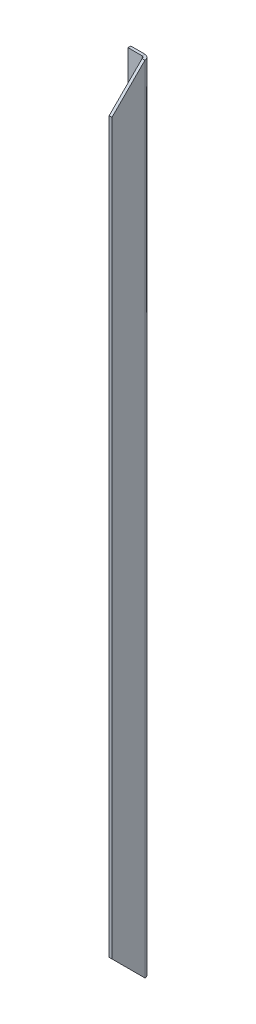
ISO-10303-21;
HEADER;
FILE_DESCRIPTION(('STEP AP214'),'2;1');
FILE_NAME('part.step','',(''),(''),'','','');
FILE_SCHEMA(('AUTOMOTIVE_DESIGN { 1 0 10303 214 1 1 1 1 }'));
ENDSEC;
DATA;
#1=APPLICATION_CONTEXT('core data for automotive mechanical design processes');
#2=APPLICATION_PROTOCOL_DEFINITION('international standard','automotive_design',2000,#1);
#3=PRODUCT_CONTEXT('',#1,'mechanical');
#4=PRODUCT('Part','Part','',(#3));
#5=PRODUCT_RELATED_PRODUCT_CATEGORY('part','',(#4));
#6=PRODUCT_DEFINITION_FORMATION('','',#4);
#7=PRODUCT_DEFINITION_CONTEXT('part definition',#1,'design');
#8=PRODUCT_DEFINITION('design','',#6,#7);
#9=PRODUCT_DEFINITION_SHAPE('','',#8);
#10=(LENGTH_UNIT() NAMED_UNIT(*) SI_UNIT(.MILLI.,.METRE.));
#11=(NAMED_UNIT(*) PLANE_ANGLE_UNIT() SI_UNIT($,.RADIAN.));
#12=(NAMED_UNIT(*) SI_UNIT($,.STERADIAN.) SOLID_ANGLE_UNIT());
#13=UNCERTAINTY_MEASURE_WITH_UNIT(LENGTH_MEASURE(1.E-05),#10,'distance_accuracy_value','');
#14=(GEOMETRIC_REPRESENTATION_CONTEXT(3) GLOBAL_UNCERTAINTY_ASSIGNED_CONTEXT((#13)) GLOBAL_UNIT_ASSIGNED_CONTEXT((#10,
#11,#12)) REPRESENTATION_CONTEXT('',''));
#15=CARTESIAN_POINT('',(0.,0.,0.));
#16=DIRECTION('',(0.,0.,1.));
#17=DIRECTION('',(1.,0.,0.));
#18=AXIS2_PLACEMENT_3D('',#15,#16,#17);
#19=CARTESIAN_POINT('',(1160.,-1198.5,-14.6953285374467));
#20=DIRECTION('',(1.,0.,0.));
#21=DIRECTION('',(0.,-1.,0.));
#22=AXIS2_PLACEMENT_3D('',#19,#20,#21);
#23=PLANE('',#22);
#24=DIRECTION('',(0.,1.,0.));
#25=VECTOR('',#24,1.);
#26=CARTESIAN_POINT('',(1160.,4.0129385336728E-12,-860.));
#27=LINE('',#26,#25);
#28=CARTESIAN_POINT('',(1160.,-1196.29289321881,-860.000000000001));
#29=VERTEX_POINT('',#28);
#30=CARTESIAN_POINT('',(1160.,-773.707106781191,-860.));
#31=VERTEX_POINT('',#30);
#32=EDGE_CURVE('E172',#29,#31,#27,.T.);
#33=ORIENTED_EDGE('',*,*,#32,.F.);
#34=DIRECTION('',(0.,0.,-1.));
#35=VECTOR('',#34,1.);
#36=CARTESIAN_POINT('',(1160.,-1196.29289321881,-14.6953285374467));
#37=LINE('',#36,#35);
#38=CARTESIAN_POINT('',(1160.,-1196.29289321881,-858.5));
#39=VERTEX_POINT('',#38);
#40=EDGE_CURVE('E174',#39,#29,#37,.T.);
#41=ORIENTED_EDGE('',*,*,#40,.F.);
#42=DIRECTION('',(0.,1.,0.));
#43=VECTOR('',#42,1.);
#44=CARTESIAN_POINT('',(1160.,-1198.5,-858.5));
#45=LINE('',#44,#43);
#46=CARTESIAN_POINT('',(1160.,-773.707106781191,-858.5));
#47=VERTEX_POINT('',#46);
#48=EDGE_CURVE('E73',#47,#39,#45,.F.);
#49=ORIENTED_EDGE('',*,*,#48,.F.);
#50=DIRECTION('',(0.,0.,-1.));
#51=VECTOR('',#50,1.);
#52=CARTESIAN_POINT('',(1160.,-773.707106781191,-14.6953285374462));
#53=LINE('',#52,#51);
#54=EDGE_CURVE('E186',#47,#31,#53,.T.);
#55=ORIENTED_EDGE('',*,*,#54,.T.);
#56=EDGE_LOOP('',(#33,#41,#49,#55));
#57=FACE_BOUND('',#56,.T.);
#58=ADVANCED_FACE('F59',(#57),#23,.F.);
#59=CARTESIAN_POINT('',(1168.5,-773.707106781191,-14.6953285374461));
#60=DIRECTION('',(0.,1.,0.));
#61=DIRECTION('',(0.,0.,1.));
#62=AXIS2_PLACEMENT_3D('',#59,#60,#61);
#63=PLANE('',#62);
#64=CARTESIAN_POINT('',(1167.5,-773.707106781191,-860.000000000001));
#65=CARTESIAN_POINT('',(1167.5,-773.707106781191,-858.5));
#66=B_SPLINE_CURVE_WITH_KNOTS('',1,(#64,#65),.UNSPECIFIED.,.F.,.F.,(2,2),(0.,1.),.UNSPECIFIED.);
#67=CARTESIAN_POINT('',(1167.5,-773.707106781191,-858.5));
#68=VERTEX_POINT('',#67);
#69=CARTESIAN_POINT('',(1167.5,-773.707106781191,-860.000000000001));
#70=VERTEX_POINT('',#69);
#71=EDGE_CURVE('E178',#68,#70,#66,.F.);
#72=ORIENTED_EDGE('',*,*,#71,.T.);
#73=DIRECTION('',(-1.,0.,0.));
#74=VECTOR('',#73,1.);
#75=CARTESIAN_POINT('',(8.88178419700125E-13,-773.707106781191,-860.000000000004));
#76=LINE('',#75,#74);
#77=EDGE_CURVE('E118',#31,#70,#76,.F.);
#78=ORIENTED_EDGE('',*,*,#77,.F.);
#79=ORIENTED_EDGE('',*,*,#54,.F.);
#80=DIRECTION('',(-1.,0.,0.));
#81=VECTOR('',#80,1.);
#82=CARTESIAN_POINT('',(1168.5,-773.707106781191,-858.5));
#83=LINE('',#82,#81);
#84=EDGE_CURVE('E180',#47,#68,#83,.F.);
#85=ORIENTED_EDGE('',*,*,#84,.T.);
#86=EDGE_LOOP('',(#72,#78,#79,#85));
#87=FACE_BOUND('',#86,.T.);
#88=ADVANCED_FACE('F179',(#87),#63,.T.);
#89=CARTESIAN_POINT('',(4.44089209850063E-13,3.70543041779033E-12,-860.000000000004));
#90=DIRECTION('',(0.,0.,-1.));
#91=DIRECTION('',(-1.,0.,0.));
#92=AXIS2_PLACEMENT_3D('',#89,#90,#91);
#93=PLANE('',#92);
#94=DIRECTION('',(-1.,0.,0.));
#95=VECTOR('',#94,1.);
#96=CARTESIAN_POINT('',(1.33226762955019E-12,-1196.29289321881,-860.000000000004));
#97=LINE('',#96,#95);
#98=CARTESIAN_POINT('',(1167.5,-1196.29289321881,-860.000000000001));
#99=VERTEX_POINT('',#98);
#100=EDGE_CURVE('E311',#99,#29,#97,.T.);
#101=ORIENTED_EDGE('',*,*,#100,.T.);
#102=ORIENTED_EDGE('',*,*,#32,.T.);
#103=ORIENTED_EDGE('',*,*,#77,.T.);
#104=DIRECTION('',(0.,-1.,0.));
#105=VECTOR('',#104,1.);
#106=CARTESIAN_POINT('',(1167.5,-1196.29289321881,-860.));
#107=LINE('',#106,#105);
#108=EDGE_CURVE('E108',#99,#70,#107,.F.);
#109=ORIENTED_EDGE('',*,*,#108,.F.);
#110=EDGE_LOOP('',(#101,#102,#103,#109));
#111=FACE_BOUND('',#110,.T.);
#112=ADVANCED_FACE('F170',(#111),#93,.T.);
#113=CARTESIAN_POINT('',(1168.5,-1196.29289321881,-14.6953285374467));
#114=DIRECTION('',(0.,1.,0.));
#115=DIRECTION('',(0.,0.,1.));
#116=AXIS2_PLACEMENT_3D('',#113,#114,#115);
#117=PLANE('',#116);
#118=ORIENTED_EDGE('',*,*,#100,.F.);
#119=CARTESIAN_POINT('',(1167.5,-1196.29289321881,-858.500000000001));
#120=CARTESIAN_POINT('',(1167.5,-1196.29289321881,-860.000000000001));
#121=B_SPLINE_CURVE_WITH_KNOTS('',1,(#119,#120),.UNSPECIFIED.,.F.,.F.,(2,2),(0.,1.),.UNSPECIFIED.);
#122=CARTESIAN_POINT('',(1167.5,-1196.29289321881,-858.5));
#123=VERTEX_POINT('',#122);
#124=EDGE_CURVE('E198',#123,#99,#121,.T.);
#125=ORIENTED_EDGE('',*,*,#124,.F.);
#126=DIRECTION('',(-1.,0.,0.));
#127=VECTOR('',#126,1.);
#128=CARTESIAN_POINT('',(1168.5,-1196.29289321881,-858.5));
#129=LINE('',#128,#127);
#130=EDGE_CURVE('E14',#39,#123,#129,.F.);
#131=ORIENTED_EDGE('',*,*,#130,.F.);
#132=ORIENTED_EDGE('',*,*,#40,.T.);
#133=EDGE_LOOP('',(#118,#125,#131,#132));
#134=FACE_BOUND('',#133,.T.);
#135=ADVANCED_FACE('F319',(#134),#117,.F.);
#136=CARTESIAN_POINT('',(4.44089209850063E-13,3.7050393469333E-12,-858.500000000004));
#137=DIRECTION('',(0.,0.,-1.));
#138=DIRECTION('',(-1.,0.,0.));
#139=AXIS2_PLACEMENT_3D('',#136,#137,#138);
#140=PLANE('',#139);
#141=DIRECTION('',(0.,-1.,0.));
#142=VECTOR('',#141,1.);
#143=CARTESIAN_POINT('',(1167.5,-1196.29289321881,-858.5));
#144=LINE('',#143,#142);
#145=EDGE_CURVE('E390',#123,#68,#144,.F.);
#146=ORIENTED_EDGE('',*,*,#145,.T.);
#147=ORIENTED_EDGE('',*,*,#84,.F.);
#148=ORIENTED_EDGE('',*,*,#48,.T.);
#149=ORIENTED_EDGE('',*,*,#130,.T.);
#150=EDGE_LOOP('',(#146,#147,#148,#149));
#151=FACE_BOUND('',#150,.T.);
#152=ADVANCED_FACE('F62',(#151),#140,.F.);
#153=CARTESIAN_POINT('',(1170.,0.,-791.500000000001));
#154=DIRECTION('',(-1.,0.,0.));
#155=DIRECTION('',(0.,-1.,0.));
#156=AXIS2_PLACEMENT_3D('',#153,#154,#155);
#157=PLANE('',#156);
#158=DIRECTION('',(0.,-1.,0.));
#159=VECTOR('',#158,1.);
#160=CARTESIAN_POINT('',(1170.,0.,-857.5));
#161=LINE('',#160,#159);
#162=CARTESIAN_POINT('',(1170.,-774.000000000004,-857.5));
#163=VERTEX_POINT('',#162);
#164=CARTESIAN_POINT('',(1170.,-1196.,-857.5));
#165=VERTEX_POINT('',#164);
#166=EDGE_CURVE('E352',#163,#165,#161,.T.);
#167=ORIENTED_EDGE('',*,*,#166,.F.);
#168=DIRECTION('',(0.,-0.707106781186554,0.707106781186541));
#169=VECTOR('',#168,1.);
#170=CARTESIAN_POINT('',(1170.,-419.999999999994,-1211.5));
#171=LINE('',#170,#169);
#172=CARTESIAN_POINT('',(1170.,-791.500000000004,-840.000000000001));
#173=VERTEX_POINT('',#172);
#174=EDGE_CURVE('E130',#163,#173,#171,.T.);
#175=ORIENTED_EDGE('',*,*,#174,.T.);
#176=DIRECTION('',(0.,-1.,0.));
#177=VECTOR('',#176,1.);
#178=CARTESIAN_POINT('',(1170.,0.,-840.000000000001));
#179=LINE('',#178,#177);
#180=CARTESIAN_POINT('',(1170.,-1178.5,-840.000000000001));
#181=VERTEX_POINT('',#180);
#182=EDGE_CURVE('E286',#181,#173,#179,.F.);
#183=ORIENTED_EDGE('',*,*,#182,.F.);
#184=DIRECTION('',(0.,-0.707106781186554,-0.707106781186541));
#185=VECTOR('',#184,1.);
#186=CARTESIAN_POINT('',(1170.,-564.999999999989,-226.500000000001));
#187=LINE('',#186,#185);
#188=EDGE_CURVE('E294',#181,#165,#187,.T.);
#189=ORIENTED_EDGE('',*,*,#188,.T.);
#190=EDGE_LOOP('',(#167,#175,#183,#189));
#191=FACE_BOUND('',#190,.T.);
#192=ADVANCED_FACE('F342',(#191),#157,.F.);
#193=CARTESIAN_POINT('',(325.274600831735,-419.999999999991,-1211.5));
#194=DIRECTION('',(0.,0.707106781186541,0.707106781186554));
#195=DIRECTION('',(0.,-0.707106781186554,0.707106781186541));
#196=AXIS2_PLACEMENT_3D('',#193,#194,#195);
#197=PLANE('',#196);
#198=ORIENTED_EDGE('',*,*,#174,.F.);
#199=CARTESIAN_POINT('',(1168.5,-774.000000000004,-857.5));
#200=CARTESIAN_POINT('',(1170.,-774.000000000004,-857.5));
#201=B_SPLINE_CURVE_WITH_KNOTS('',1,(#199,#200),.UNSPECIFIED.,.F.,.F.,(2,2),(0.,1.),.UNSPECIFIED.);
#202=CARTESIAN_POINT('',(1168.5,-774.000000000004,-857.5));
#203=VERTEX_POINT('',#202);
#204=EDGE_CURVE('E203',#203,#163,#201,.T.);
#205=ORIENTED_EDGE('',*,*,#204,.F.);
#206=DIRECTION('',(0.,-0.707106781186554,0.707106781186541));
#207=VECTOR('',#206,1.);
#208=CARTESIAN_POINT('',(1168.5,-419.999999999994,-1211.5));
#209=LINE('',#208,#207);
#210=CARTESIAN_POINT('',(1168.5,-791.500000000004,-840.000000000001));
#211=VERTEX_POINT('',#210);
#212=EDGE_CURVE('E416',#203,#211,#209,.T.);
#213=ORIENTED_EDGE('',*,*,#212,.T.);
#214=DIRECTION('',(1.,0.,0.));
#215=VECTOR('',#214,1.);
#216=CARTESIAN_POINT('',(325.274600831733,-791.500000000001,-840.000000000001));
#217=LINE('',#216,#215);
#218=EDGE_CURVE('E300',#211,#173,#217,.T.);
#219=ORIENTED_EDGE('',*,*,#218,.T.);
#220=EDGE_LOOP('',(#198,#205,#213,#219));
#221=FACE_BOUND('',#220,.T.);
#222=ADVANCED_FACE('F337',(#221),#197,.T.);
#223=CARTESIAN_POINT('',(325.274600831734,-564.999999999986,-226.500000000001));
#224=DIRECTION('',(0.,-0.707106781186541,0.707106781186554));
#225=DIRECTION('',(0.,-0.707106781186554,-0.707106781186541));
#226=AXIS2_PLACEMENT_3D('',#223,#224,#225);
#227=PLANE('',#226);
#228=ORIENTED_EDGE('',*,*,#188,.F.);
#229=DIRECTION('',(1.,0.,0.));
#230=VECTOR('',#229,1.);
#231=CARTESIAN_POINT('',(325.274600831733,-1178.5,-840.000000000001));
#232=LINE('',#231,#230);
#233=CARTESIAN_POINT('',(1168.5,-1178.5,-840.000000000001));
#234=VERTEX_POINT('',#233);
#235=EDGE_CURVE('E469',#234,#181,#232,.T.);
#236=ORIENTED_EDGE('',*,*,#235,.F.);
#237=DIRECTION('',(0.,-0.707106781186554,-0.707106781186541));
#238=VECTOR('',#237,1.);
#239=CARTESIAN_POINT('',(1168.5,-564.999999999989,-226.500000000001));
#240=LINE('',#239,#238);
#241=CARTESIAN_POINT('',(1168.5,-1196.,-857.5));
#242=VERTEX_POINT('',#241);
#243=EDGE_CURVE('E301',#234,#242,#240,.T.);
#244=ORIENTED_EDGE('',*,*,#243,.T.);
#245=CARTESIAN_POINT('',(1170.,-1196.,-857.5));
#246=CARTESIAN_POINT('',(1168.5,-1196.,-857.5));
#247=B_SPLINE_CURVE_WITH_KNOTS('',1,(#245,#246),.UNSPECIFIED.,.F.,.F.,(2,2),(0.,1.),.UNSPECIFIED.);
#248=EDGE_CURVE('E274',#242,#165,#247,.F.);
#249=ORIENTED_EDGE('',*,*,#248,.T.);
#250=EDGE_LOOP('',(#228,#236,#244,#249));
#251=FACE_BOUND('',#250,.T.);
#252=ADVANCED_FACE('F341',(#251),#227,.T.);
#253=CARTESIAN_POINT('',(325.274600831732,-791.500000000001,-840.000000000001));
#254=DIRECTION('',(0.,0.,-1.));
#255=DIRECTION('',(0.,1.,0.));
#256=AXIS2_PLACEMENT_3D('',#253,#254,#255);
#257=PLANE('',#256);
#258=ORIENTED_EDGE('',*,*,#235,.T.);
#259=ORIENTED_EDGE('',*,*,#182,.T.);
#260=ORIENTED_EDGE('',*,*,#218,.F.);
#261=DIRECTION('',(0.,1.,0.));
#262=VECTOR('',#261,1.);
#263=CARTESIAN_POINT('',(1168.5,-791.500000000004,-840.000000000001));
#264=LINE('',#263,#262);
#265=EDGE_CURVE('E295',#234,#211,#264,.T.);
#266=ORIENTED_EDGE('',*,*,#265,.F.);
#267=EDGE_LOOP('',(#258,#259,#260,#266));
#268=FACE_BOUND('',#267,.T.);
#269=ADVANCED_FACE('F484',(#268),#257,.F.);
#270=CARTESIAN_POINT('',(1168.5,0.,-791.500000000001));
#271=DIRECTION('',(-1.,0.,0.));
#272=DIRECTION('',(0.,-1.,0.));
#273=AXIS2_PLACEMENT_3D('',#270,#271,#272);
#274=PLANE('',#273);
#275=ORIENTED_EDGE('',*,*,#212,.F.);
#276=DIRECTION('',(0.,-1.,0.));
#277=VECTOR('',#276,1.);
#278=CARTESIAN_POINT('',(1168.5,0.,-857.5));
#279=LINE('',#278,#277);
#280=EDGE_CURVE('E392',#203,#242,#279,.T.);
#281=ORIENTED_EDGE('',*,*,#280,.T.);
#282=ORIENTED_EDGE('',*,*,#243,.F.);
#283=ORIENTED_EDGE('',*,*,#265,.T.);
#284=EDGE_LOOP('',(#275,#281,#282,#283));
#285=FACE_BOUND('',#284,.T.);
#286=ADVANCED_FACE('F482',(#285),#274,.T.);
#287=CARTESIAN_POINT('',(1170.,-1196.,-857.5));
#288=CARTESIAN_POINT('',(1170.,-1196.02441214454,-857.827307910489));
#289=CARTESIAN_POINT('',(1169.93493169167,-1196.04881553647,-858.154369710899));
#290=CARTESIAN_POINT('',(1169.68446597088,-1196.09763107294,-858.759047450928));
#291=CARTESIAN_POINT('',(1169.49916710599,-1196.12203884117,-859.036366799938));
#292=CARTESIAN_POINT('',(1169.03636679994,-1196.17085437764,-859.499167105996));
#293=CARTESIAN_POINT('',(1168.75904745093,-1196.19526214588,-859.684465970887));
#294=CARTESIAN_POINT('',(1168.1543697109,-1196.24407768234,-859.934931691672));
#295=CARTESIAN_POINT('',(1167.82730791049,-1196.26848107427,-860.000000000001));
#296=CARTESIAN_POINT('',(1167.5,-1196.29289321881,-860.000000000001));
#297=CARTESIAN_POINT('',(1168.5,-1196.,-857.5));
#298=CARTESIAN_POINT('',(1168.5,-1196.02441202103,-857.630922501776));
#299=CARTESIAN_POINT('',(1168.47397267667,-1196.04881553647,-857.76174788436));
#300=CARTESIAN_POINT('',(1168.37378638835,-1196.09763107294,-858.003618980372));
#301=CARTESIAN_POINT('',(1168.2996668424,-1196.12203884117,-858.114546719976));
#302=CARTESIAN_POINT('',(1168.11454671997,-1196.17085437764,-858.299666842399));
#303=CARTESIAN_POINT('',(1168.00361898037,-1196.19526214588,-858.373786388355));
#304=CARTESIAN_POINT('',(1167.76174788436,-1196.24407768234,-858.473972676669));
#305=CARTESIAN_POINT('',(1167.63092250177,-1196.26848119779,-858.500000000001));
#306=CARTESIAN_POINT('',(1167.5,-1196.29289321881,-858.500000000001));
#307=B_SPLINE_SURFACE_WITH_KNOTS('',1,3,((#287,#288,#289,#290,#291,#292,#293,#294,#295,#296),
(#297,#298,#299,#300,#301,#302,#303,#304,#305,#306)),.UNSPECIFIED.,.F.,.F.,.F.,(2,2),(4,2,2,2,
4),(0.,1.),(0.,0.25,0.5,0.75,1.),.UNSPECIFIED.);
#308=CARTESIAN_POINT('',(1168.5,-1196.,-857.5));
#309=CARTESIAN_POINT('',(1168.5,-1196.02441202103,-857.630922501776));
#310=CARTESIAN_POINT('',(1168.47397267667,-1196.04881553647,-857.76174788436));
#311=CARTESIAN_POINT('',(1168.37378638835,-1196.09763107294,-858.003618980372));
#312=CARTESIAN_POINT('',(1168.2996668424,-1196.12203884117,-858.114546719976));
#313=CARTESIAN_POINT('',(1168.11454671997,-1196.17085437764,-858.299666842399));
#314=CARTESIAN_POINT('',(1168.00361898037,-1196.19526214588,-858.373786388355));
#315=CARTESIAN_POINT('',(1167.76174788436,-1196.24407768234,-858.473972676669));
#316=CARTESIAN_POINT('',(1167.63092250177,-1196.26848119779,-858.500000000001));
#317=CARTESIAN_POINT('',(1167.5,-1196.29289321881,-858.500000000001));
#318=B_SPLINE_CURVE_WITH_KNOTS('',3,(#308,#309,#310,#311,#312,#313,#314,#315,#316,#317),
.UNSPECIFIED.,.F.,.F.,(4,2,2,2,4),(0.,0.25,0.5,0.75,1.),.UNSPECIFIED.);
#319=EDGE_CURVE('E142',#242,#123,#318,.T.);
#320=CARTESIAN_POINT('',(1167.5,-1196.29289321881,-860.000000000001));
#321=CARTESIAN_POINT('',(1167.82730791049,-1196.26848107427,-860.000000000001));
#322=CARTESIAN_POINT('',(1168.1543697109,-1196.24407768234,-859.934931691672));
#323=CARTESIAN_POINT('',(1168.75904745093,-1196.19526214588,-859.684465970887));
#324=CARTESIAN_POINT('',(1169.03636679994,-1196.17085437764,-859.499167105996));
#325=CARTESIAN_POINT('',(1169.49916710599,-1196.12203884117,-859.036366799938));
#326=CARTESIAN_POINT('',(1169.68446597088,-1196.09763107294,-858.759047450928));
#327=CARTESIAN_POINT('',(1169.93493169167,-1196.04881553647,-858.154369710899));
#328=CARTESIAN_POINT('',(1170.,-1196.02441214454,-857.827307910489));
#329=CARTESIAN_POINT('',(1170.,-1196.,-857.5));
#330=B_SPLINE_CURVE_WITH_KNOTS('',3,(#320,#321,#322,#323,#324,#325,#326,#327,#328,#329),
.UNSPECIFIED.,.F.,.F.,(4,2,2,2,4),(0.,0.25,0.5,0.75,1.),.UNSPECIFIED.);
#331=EDGE_CURVE('E195',#165,#99,#330,.F.);
#332=ORIENTED_EDGE('',*,*,#248,.F.);
#333=ORIENTED_EDGE('',*,*,#319,.T.);
#334=ORIENTED_EDGE('',*,*,#124,.T.);
#335=ORIENTED_EDGE('',*,*,#331,.F.);
#336=EDGE_LOOP('',(#332,#333,#334,#335));
#337=FACE_BOUND('',#336,.T.);
#338=ADVANCED_FACE('F230',(#337),#307,.T.);
#339=CARTESIAN_POINT('',(1167.5,-773.707106781191,-860.000000000001));
#340=CARTESIAN_POINT('',(1167.82730791049,-773.731518925734,-860.000000000001));
#341=CARTESIAN_POINT('',(1168.1543697109,-773.755922317659,-859.934931691671));
#342=CARTESIAN_POINT('',(1168.75904745093,-773.804737854128,-859.684465970886));
#343=CARTESIAN_POINT('',(1169.03636679994,-773.829145622363,-859.499167105996));
#344=CARTESIAN_POINT('',(1169.499167106,-773.877961158832,-859.036366799938));
#345=CARTESIAN_POINT('',(1169.68446597089,-773.902368927066,-858.759047450928));
#346=CARTESIAN_POINT('',(1169.93493169167,-773.951184463535,-858.154369710899));
#347=CARTESIAN_POINT('',(1170.,-773.97558785546,-857.82730791049));
#348=CARTESIAN_POINT('',(1170.,-774.000000000004,-857.5));
#349=CARTESIAN_POINT('',(1167.5,-773.707106781191,-858.5));
#350=CARTESIAN_POINT('',(1167.63092250178,-773.731518802218,-858.5));
#351=CARTESIAN_POINT('',(1167.76174788436,-773.755922317659,-858.473972676669));
#352=CARTESIAN_POINT('',(1168.00361898037,-773.804737854128,-858.373786388355));
#353=CARTESIAN_POINT('',(1168.11454671998,-773.829145622363,-858.299666842399));
#354=CARTESIAN_POINT('',(1168.2996668424,-773.877961158832,-858.114546719975));
#355=CARTESIAN_POINT('',(1168.37378638835,-773.902368927066,-858.003618980371));
#356=CARTESIAN_POINT('',(1168.47397267667,-773.951184463535,-857.76174788436));
#357=CARTESIAN_POINT('',(1168.5,-773.975587978976,-857.630922501776));
#358=CARTESIAN_POINT('',(1168.5,-774.000000000004,-857.5));
#359=B_SPLINE_SURFACE_WITH_KNOTS('',1,3,((#339,#340,#341,#342,#343,#344,#345,#346,#347,#348),
(#349,#350,#351,#352,#353,#354,#355,#356,#357,#358)),.UNSPECIFIED.,.F.,.F.,.F.,(2,2),(4,2,2,2,
4),(0.,1.),(0.,0.25,0.5,0.75,1.),.UNSPECIFIED.);
#360=CARTESIAN_POINT('',(1167.5,-773.707106781191,-858.5));
#361=CARTESIAN_POINT('',(1167.63092250178,-773.731518802218,-858.5));
#362=CARTESIAN_POINT('',(1167.76174788436,-773.755922317659,-858.473972676669));
#363=CARTESIAN_POINT('',(1168.00361898037,-773.804737854128,-858.373786388355));
#364=CARTESIAN_POINT('',(1168.11454671998,-773.829145622363,-858.299666842399));
#365=CARTESIAN_POINT('',(1168.2996668424,-773.877961158832,-858.114546719975));
#366=CARTESIAN_POINT('',(1168.37378638835,-773.902368927066,-858.003618980371));
#367=CARTESIAN_POINT('',(1168.47397267667,-773.951184463535,-857.76174788436));
#368=CARTESIAN_POINT('',(1168.5,-773.975587978976,-857.630922501776));
#369=CARTESIAN_POINT('',(1168.5,-774.000000000004,-857.5));
#370=B_SPLINE_CURVE_WITH_KNOTS('',3,(#360,#361,#362,#363,#364,#365,#366,#367,#368,#369),
.UNSPECIFIED.,.F.,.F.,(4,2,2,2,4),(0.,0.25,0.5,0.75,1.),.UNSPECIFIED.);
#371=EDGE_CURVE('E389',#68,#203,#370,.T.);
#372=CARTESIAN_POINT('',(1170.,-774.000000000004,-857.5));
#373=CARTESIAN_POINT('',(1170.,-773.97558785546,-857.82730791049));
#374=CARTESIAN_POINT('',(1169.93493169167,-773.951184463535,-858.154369710899));
#375=CARTESIAN_POINT('',(1169.68446597089,-773.902368927066,-858.759047450928));
#376=CARTESIAN_POINT('',(1169.499167106,-773.877961158832,-859.036366799938));
#377=CARTESIAN_POINT('',(1169.03636679994,-773.829145622363,-859.499167105996));
#378=CARTESIAN_POINT('',(1168.75904745093,-773.804737854128,-859.684465970886));
#379=CARTESIAN_POINT('',(1168.1543697109,-773.755922317659,-859.934931691671));
#380=CARTESIAN_POINT('',(1167.82730791049,-773.731518925734,-860.000000000001));
#381=CARTESIAN_POINT('',(1167.5,-773.707106781191,-860.000000000001));
#382=B_SPLINE_CURVE_WITH_KNOTS('',3,(#372,#373,#374,#375,#376,#377,#378,#379,#380,#381),
.UNSPECIFIED.,.F.,.F.,(4,2,2,2,4),(0.,0.25,0.5,0.75,1.),.UNSPECIFIED.);
#383=EDGE_CURVE('E193',#70,#163,#382,.F.);
#384=ORIENTED_EDGE('',*,*,#71,.F.);
#385=ORIENTED_EDGE('',*,*,#371,.T.);
#386=ORIENTED_EDGE('',*,*,#204,.T.);
#387=ORIENTED_EDGE('',*,*,#383,.F.);
#388=EDGE_LOOP('',(#384,#385,#386,#387));
#389=FACE_BOUND('',#388,.T.);
#390=ADVANCED_FACE('F201',(#389),#359,.T.);
#391=CARTESIAN_POINT('',(1167.5,-350.371266985245,-857.5));
#392=DIRECTION('',(0.,-1.,0.));
#393=DIRECTION('',(1.,0.,0.));
#394=AXIS2_PLACEMENT_3D('',#391,#392,#393);
#395=CYLINDRICAL_SURFACE('',#394,2.50000000000026);
#396=ORIENTED_EDGE('',*,*,#383,.T.);
#397=ORIENTED_EDGE('',*,*,#166,.T.);
#398=ORIENTED_EDGE('',*,*,#331,.T.);
#399=ORIENTED_EDGE('',*,*,#108,.T.);
#400=EDGE_LOOP('',(#396,#397,#398,#399));
#401=FACE_BOUND('',#400,.T.);
#402=ADVANCED_FACE('F191',(#401),#395,.T.);
#403=CARTESIAN_POINT('',(1167.5,-350.371266985245,-857.5));
#404=DIRECTION('',(0.,-1.,0.));
#405=DIRECTION('',(1.,0.,0.));
#406=AXIS2_PLACEMENT_3D('',#403,#404,#405);
#407=CYLINDRICAL_SURFACE('',#406,1.0000000000002);
#408=ORIENTED_EDGE('',*,*,#371,.F.);
#409=ORIENTED_EDGE('',*,*,#145,.F.);
#410=ORIENTED_EDGE('',*,*,#319,.F.);
#411=ORIENTED_EDGE('',*,*,#280,.F.);
#412=EDGE_LOOP('',(#408,#409,#410,#411));
#413=FACE_BOUND('',#412,.T.);
#414=ADVANCED_FACE('F232',(#413),#407,.F.);
#415=CLOSED_SHELL('',(#58,#88,#112,#135,#152,#192,#222,#252,#269,#286,#338,#390,#402,#414));
#416=MANIFOLD_SOLID_BREP('B2',#415);
#417=ADVANCED_BREP_SHAPE_REPRESENTATION('',(#18,#416),#14);
#418=SHAPE_DEFINITION_REPRESENTATION(#9,#417);
ENDSEC;
END-ISO-10303-21;
